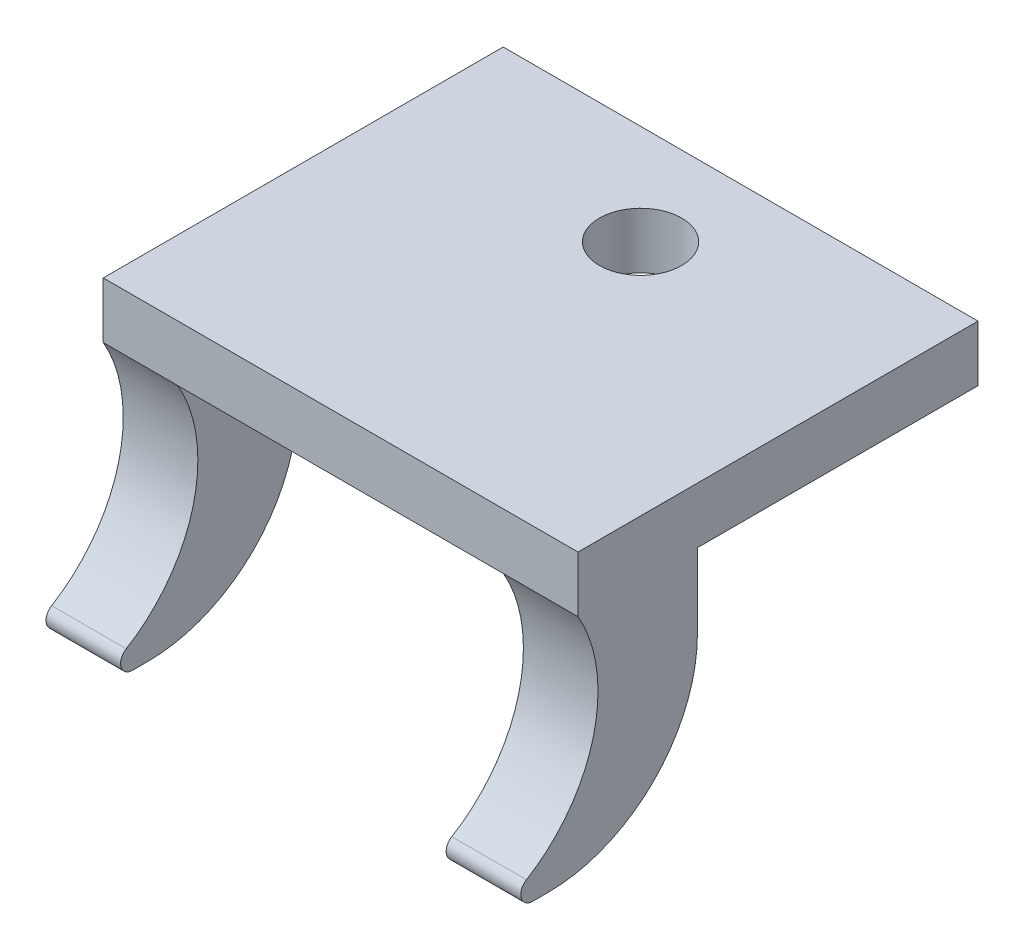
ISO-10303-21;
HEADER;
FILE_DESCRIPTION(('STEP AP214'),'2;1');
FILE_NAME('part.step','',(''),(''),'','','');
FILE_SCHEMA(('AUTOMOTIVE_DESIGN { 1 0 10303 214 1 1 1 1 }'));
ENDSEC;
DATA;
#1=APPLICATION_CONTEXT('core data for automotive mechanical design processes');
#2=APPLICATION_PROTOCOL_DEFINITION('international standard','automotive_design',2000,#1);
#3=PRODUCT_CONTEXT('',#1,'mechanical');
#4=PRODUCT('Part','Part','',(#3));
#5=PRODUCT_RELATED_PRODUCT_CATEGORY('part','',(#4));
#6=PRODUCT_DEFINITION_FORMATION('','',#4);
#7=PRODUCT_DEFINITION_CONTEXT('part definition',#1,'design');
#8=PRODUCT_DEFINITION('design','',#6,#7);
#9=PRODUCT_DEFINITION_SHAPE('','',#8);
#10=(LENGTH_UNIT() NAMED_UNIT(*) SI_UNIT(.MILLI.,.METRE.));
#11=(NAMED_UNIT(*) PLANE_ANGLE_UNIT() SI_UNIT($,.RADIAN.));
#12=(NAMED_UNIT(*) SI_UNIT($,.STERADIAN.) SOLID_ANGLE_UNIT());
#13=UNCERTAINTY_MEASURE_WITH_UNIT(LENGTH_MEASURE(1.E-05),#10,'distance_accuracy_value','');
#14=(GEOMETRIC_REPRESENTATION_CONTEXT(3) GLOBAL_UNCERTAINTY_ASSIGNED_CONTEXT((#13)) GLOBAL_UNIT_ASSIGNED_CONTEXT((#10,
#11,#12)) REPRESENTATION_CONTEXT('',''));
#15=CARTESIAN_POINT('',(0.,0.,0.));
#16=DIRECTION('',(0.,0.,1.));
#17=DIRECTION('',(1.,0.,0.));
#18=AXIS2_PLACEMENT_3D('',#15,#16,#17);
#19=CARTESIAN_POINT('',(0.,0.,0.));
#20=DIRECTION('',(0.,-1.,0.));
#21=DIRECTION('',(0.,0.,-1.));
#22=AXIS2_PLACEMENT_3D('',#19,#20,#21);
#23=PLANE('',#22);
#24=CARTESIAN_POINT('',(20.20062,0.,-25.5224165246659));
#25=DIRECTION('',(0.,1.,0.));
#26=DIRECTION('',(0.,0.,1.));
#27=AXIS2_PLACEMENT_3D('',#24,#25,#26);
#28=CIRCLE('',#27,3.5);
#29=CARTESIAN_POINT('',(20.20062,0.,-22.0224165246659));
#30=VERTEX_POINT('',#29);
#31=EDGE_CURVE('E228',#30,#30,#28,.T.);
#32=ORIENTED_EDGE('',*,*,#31,.T.);
#33=EDGE_LOOP('',(#32));
#34=FACE_BOUND('',#33,.T.);
#35=DIRECTION('',(0.,0.,1.));
#36=VECTOR('',#35,1.);
#37=CARTESIAN_POINT('',(6.35,0.,-10.16));
#38=LINE('',#37,#36);
#39=CARTESIAN_POINT('',(6.35,0.,-10.16));
#40=VERTEX_POINT('',#39);
#41=CARTESIAN_POINT('',(6.35,0.,0.));
#42=VERTEX_POINT('',#41);
#43=EDGE_CURVE('E151',#40,#42,#38,.T.);
#44=ORIENTED_EDGE('',*,*,#43,.F.);
#45=DIRECTION('',(-1.,0.,0.));
#46=VECTOR('',#45,1.);
#47=CARTESIAN_POINT('',(6.35,0.,-10.16));
#48=LINE('',#47,#46);
#49=CARTESIAN_POINT('',(0.,0.,-10.16));
#50=VERTEX_POINT('',#49);
#51=EDGE_CURVE('E162',#40,#50,#48,.T.);
#52=ORIENTED_EDGE('',*,*,#51,.T.);
#53=DIRECTION('',(0.,0.,1.));
#54=VECTOR('',#53,1.);
#55=CARTESIAN_POINT('',(0.,0.,0.));
#56=LINE('',#55,#54);
#57=CARTESIAN_POINT('',(0.,0.,-34.036));
#58=VERTEX_POINT('',#57);
#59=EDGE_CURVE('E232',#58,#50,#56,.T.);
#60=ORIENTED_EDGE('',*,*,#59,.F.);
#61=DIRECTION('',(-1.,0.,0.));
#62=VECTOR('',#61,1.);
#63=CARTESIAN_POINT('',(0.,0.,-34.036));
#64=LINE('',#63,#62);
#65=CARTESIAN_POINT('',(40.40124,0.,-34.036));
#66=VERTEX_POINT('',#65);
#67=EDGE_CURVE('E238',#66,#58,#64,.T.);
#68=ORIENTED_EDGE('',*,*,#67,.F.);
#69=DIRECTION('',(0.,0.,-1.));
#70=VECTOR('',#69,1.);
#71=CARTESIAN_POINT('',(40.40124,0.,0.));
#72=LINE('',#71,#70);
#73=CARTESIAN_POINT('',(40.40124,0.,-10.16));
#74=VERTEX_POINT('',#73);
#75=EDGE_CURVE('E253',#74,#66,#72,.T.);
#76=ORIENTED_EDGE('',*,*,#75,.F.);
#77=DIRECTION('',(1.,0.,0.));
#78=VECTOR('',#77,1.);
#79=CARTESIAN_POINT('',(34.05124,0.,-10.16));
#80=LINE('',#79,#78);
#81=CARTESIAN_POINT('',(34.05124,0.,-10.16));
#82=VERTEX_POINT('',#81);
#83=EDGE_CURVE('E208',#82,#74,#80,.T.);
#84=ORIENTED_EDGE('',*,*,#83,.F.);
#85=DIRECTION('',(0.,0.,1.));
#86=VECTOR('',#85,1.);
#87=CARTESIAN_POINT('',(34.05124,0.,-10.16));
#88=LINE('',#87,#86);
#89=CARTESIAN_POINT('',(34.05124,0.,0.));
#90=VERTEX_POINT('',#89);
#91=EDGE_CURVE('E205',#82,#90,#88,.T.);
#92=ORIENTED_EDGE('',*,*,#91,.T.);
#93=DIRECTION('',(1.,0.,0.));
#94=VECTOR('',#93,1.);
#95=CARTESIAN_POINT('',(0.,0.,0.));
#96=LINE('',#95,#94);
#97=EDGE_CURVE('E173',#42,#90,#96,.T.);
#98=ORIENTED_EDGE('',*,*,#97,.F.);
#99=EDGE_LOOP('',(#44,#52,#60,#68,#76,#84,#92,#98));
#100=FACE_BOUND('',#99,.T.);
#101=ADVANCED_FACE('F39',(#34,#100),#23,.T.);
#102=CARTESIAN_POINT('',(0.,4.7625,0.));
#103=DIRECTION('',(0.,-1.,0.));
#104=DIRECTION('',(0.,0.,-1.));
#105=AXIS2_PLACEMENT_3D('',#102,#103,#104);
#106=PLANE('',#105);
#107=CARTESIAN_POINT('',(20.20062,4.7625,-25.5224165246659));
#108=DIRECTION('',(0.,1.,0.));
#109=DIRECTION('',(0.,0.,1.));
#110=AXIS2_PLACEMENT_3D('',#107,#108,#109);
#111=CIRCLE('',#110,3.5);
#112=CARTESIAN_POINT('',(20.20062,4.7625,-22.0224165246659));
#113=VERTEX_POINT('',#112);
#114=EDGE_CURVE('E221',#113,#113,#111,.T.);
#115=ORIENTED_EDGE('',*,*,#114,.F.);
#116=EDGE_LOOP('',(#115));
#117=FACE_BOUND('',#116,.T.);
#118=DIRECTION('',(0.,0.,1.));
#119=VECTOR('',#118,1.);
#120=CARTESIAN_POINT('',(0.,4.7625,0.));
#121=LINE('',#120,#119);
#122=CARTESIAN_POINT('',(0.,4.7625,-34.036));
#123=VERTEX_POINT('',#122);
#124=CARTESIAN_POINT('',(0.,4.7625,0.));
#125=VERTEX_POINT('',#124);
#126=EDGE_CURVE('E233',#123,#125,#121,.T.);
#127=ORIENTED_EDGE('',*,*,#126,.T.);
#128=DIRECTION('',(1.,0.,0.));
#129=VECTOR('',#128,1.);
#130=CARTESIAN_POINT('',(0.,4.7625,0.));
#131=LINE('',#130,#129);
#132=CARTESIAN_POINT('',(40.40124,4.7625,0.));
#133=VERTEX_POINT('',#132);
#134=EDGE_CURVE('E237',#125,#133,#131,.T.);
#135=ORIENTED_EDGE('',*,*,#134,.T.);
#136=DIRECTION('',(0.,0.,-1.));
#137=VECTOR('',#136,1.);
#138=CARTESIAN_POINT('',(40.40124,4.7625,0.));
#139=LINE('',#138,#137);
#140=CARTESIAN_POINT('',(40.40124,4.7625,-34.036));
#141=VERTEX_POINT('',#140);
#142=EDGE_CURVE('E241',#133,#141,#139,.T.);
#143=ORIENTED_EDGE('',*,*,#142,.T.);
#144=DIRECTION('',(-1.,0.,0.));
#145=VECTOR('',#144,1.);
#146=CARTESIAN_POINT('',(0.,4.7625,-34.036));
#147=LINE('',#146,#145);
#148=EDGE_CURVE('E244',#141,#123,#147,.T.);
#149=ORIENTED_EDGE('',*,*,#148,.T.);
#150=EDGE_LOOP('',(#127,#135,#143,#149));
#151=FACE_BOUND('',#150,.T.);
#152=ADVANCED_FACE('F356',(#117,#151),#106,.F.);
#153=CARTESIAN_POINT('',(0.,4.7625,0.));
#154=DIRECTION('',(1.,0.,0.));
#155=DIRECTION('',(0.,0.,-1.));
#156=AXIS2_PLACEMENT_3D('',#153,#154,#155);
#157=PLANE('',#156);
#158=DIRECTION('',(0.,1.,0.));
#159=VECTOR('',#158,1.);
#160=CARTESIAN_POINT('',(0.,-19.05,-10.16));
#161=LINE('',#160,#159);
#162=CARTESIAN_POINT('',(0.,-6.35,-10.16));
#163=VERTEX_POINT('',#162);
#164=EDGE_CURVE('E165',#163,#50,#161,.T.);
#165=ORIENTED_EDGE('',*,*,#164,.F.);
#166=CARTESIAN_POINT('',(0.,-6.35,2.54000000000005));
#167=DIRECTION('',(1.,0.,0.));
#168=DIRECTION('',(0.,0.,-1.));
#169=AXIS2_PLACEMENT_3D('',#166,#167,#168);
#170=CIRCLE('',#169,12.7);
#171=CARTESIAN_POINT('',(0.,-19.05,2.54000000000005));
#172=VERTEX_POINT('',#171);
#173=EDGE_CURVE('E302',#163,#172,#170,.F.);
#174=ORIENTED_EDGE('',*,*,#173,.T.);
#175=DIRECTION('',(0.,0.,-1.));
#176=VECTOR('',#175,1.);
#177=CARTESIAN_POINT('',(0.,-19.05,10.9985226280624));
#178=LINE('',#177,#176);
#179=CARTESIAN_POINT('',(0.,-19.05,3.87111075558023));
#180=VERTEX_POINT('',#179);
#181=EDGE_CURVE('E179',#180,#172,#178,.T.);
#182=ORIENTED_EDGE('',*,*,#181,.F.);
#183=CARTESIAN_POINT('',(0.,-18.05,3.87111075558023));
#184=DIRECTION('',(1.,0.,0.));
#185=DIRECTION('',(0.,0.,-1.));
#186=AXIS2_PLACEMENT_3D('',#183,#184,#185);
#187=CIRCLE('',#186,1.);
#188=CARTESIAN_POINT('',(0.,-17.1959854014599,4.39135979736725));
#189=VERTEX_POINT('',#188);
#190=EDGE_CURVE('E277',#180,#189,#187,.F.);
#191=ORIENTED_EDGE('',*,*,#190,.T.);
#192=CARTESIAN_POINT('',(0.,-6.35,10.9985226280624));
#193=DIRECTION('',(-1.,0.,0.));
#194=DIRECTION('',(0.,0.,-1.));
#195=AXIS2_PLACEMENT_3D('',#192,#193,#194);
#196=CIRCLE('',#195,12.7);
#197=CARTESIAN_POINT('',(0.,0.,0.));
#198=VERTEX_POINT('',#197);
#199=EDGE_CURVE('E184',#198,#189,#196,.T.);
#200=ORIENTED_EDGE('',*,*,#199,.F.);
#201=DIRECTION('',(0.,-1.,0.));
#202=VECTOR('',#201,1.);
#203=CARTESIAN_POINT('',(0.,4.7625,0.));
#204=LINE('',#203,#202);
#205=EDGE_CURVE('E269',#125,#198,#204,.T.);
#206=ORIENTED_EDGE('',*,*,#205,.F.);
#207=ORIENTED_EDGE('',*,*,#126,.F.);
#208=DIRECTION('',(0.,-1.,0.));
#209=VECTOR('',#208,1.);
#210=CARTESIAN_POINT('',(0.,4.7625,-34.036));
#211=LINE('',#210,#209);
#212=EDGE_CURVE('E247',#123,#58,#211,.T.);
#213=ORIENTED_EDGE('',*,*,#212,.T.);
#214=ORIENTED_EDGE('',*,*,#59,.T.);
#215=EDGE_LOOP('',(#165,#174,#182,#191,#200,#206,#207,#213,#214));
#216=FACE_BOUND('',#215,.T.);
#217=ADVANCED_FACE('F362',(#216),#157,.F.);
#218=CARTESIAN_POINT('',(0.,4.7625,0.));
#219=DIRECTION('',(0.,0.,-1.));
#220=DIRECTION('',(-1.,0.,0.));
#221=AXIS2_PLACEMENT_3D('',#218,#219,#220);
#222=PLANE('',#221);
#223=EDGE_CURVE('E250',#198,#42,#96,.T.);
#224=ORIENTED_EDGE('',*,*,#223,.T.);
#225=ORIENTED_EDGE('',*,*,#97,.T.);
#226=DIRECTION('',(1.,0.,0.));
#227=VECTOR('',#226,1.);
#228=CARTESIAN_POINT('',(34.05124,0.,0.));
#229=LINE('',#228,#227);
#230=CARTESIAN_POINT('',(40.40124,0.,0.));
#231=VERTEX_POINT('',#230);
#232=EDGE_CURVE('E217',#90,#231,#229,.T.);
#233=ORIENTED_EDGE('',*,*,#232,.T.);
#234=DIRECTION('',(0.,-1.,0.));
#235=VECTOR('',#234,1.);
#236=CARTESIAN_POINT('',(40.40124,4.7625,0.));
#237=LINE('',#236,#235);
#238=EDGE_CURVE('E265',#133,#231,#237,.T.);
#239=ORIENTED_EDGE('',*,*,#238,.F.);
#240=ORIENTED_EDGE('',*,*,#134,.F.);
#241=ORIENTED_EDGE('',*,*,#205,.T.);
#242=EDGE_LOOP('',(#224,#225,#233,#239,#240,#241));
#243=FACE_BOUND('',#242,.T.);
#244=ADVANCED_FACE('F319',(#243),#222,.F.);
#245=CARTESIAN_POINT('',(40.40124,4.7625,0.));
#246=DIRECTION('',(-1.,0.,0.));
#247=DIRECTION('',(0.,0.,1.));
#248=AXIS2_PLACEMENT_3D('',#245,#246,#247);
#249=PLANE('',#248);
#250=DIRECTION('',(0.,0.,-1.));
#251=VECTOR('',#250,1.);
#252=CARTESIAN_POINT('',(40.40124,-19.05,10.9985226280624));
#253=LINE('',#252,#251);
#254=CARTESIAN_POINT('',(40.40124,-19.05,3.87111075558023));
#255=VERTEX_POINT('',#254);
#256=CARTESIAN_POINT('',(40.40124,-19.05,2.54000000000005));
#257=VERTEX_POINT('',#256);
#258=EDGE_CURVE('E212',#255,#257,#253,.T.);
#259=ORIENTED_EDGE('',*,*,#258,.T.);
#260=CARTESIAN_POINT('',(40.40124,-6.35,2.54000000000005));
#261=DIRECTION('',(-1.,0.,0.));
#262=DIRECTION('',(0.,0.,1.));
#263=AXIS2_PLACEMENT_3D('',#260,#261,#262);
#264=CIRCLE('',#263,12.7);
#265=CARTESIAN_POINT('',(40.40124,-6.35,-10.16));
#266=VERTEX_POINT('',#265);
#267=EDGE_CURVE('E62',#257,#266,#264,.F.);
#268=ORIENTED_EDGE('',*,*,#267,.T.);
#269=DIRECTION('',(0.,1.,0.));
#270=VECTOR('',#269,1.);
#271=CARTESIAN_POINT('',(40.40124,-19.05,-10.16));
#272=LINE('',#271,#270);
#273=EDGE_CURVE('E198',#266,#74,#272,.T.);
#274=ORIENTED_EDGE('',*,*,#273,.T.);
#275=ORIENTED_EDGE('',*,*,#75,.T.);
#276=DIRECTION('',(0.,-1.,0.));
#277=VECTOR('',#276,1.);
#278=CARTESIAN_POINT('',(40.40124,4.7625,-34.036));
#279=LINE('',#278,#277);
#280=EDGE_CURVE('E261',#141,#66,#279,.T.);
#281=ORIENTED_EDGE('',*,*,#280,.F.);
#282=ORIENTED_EDGE('',*,*,#142,.F.);
#283=ORIENTED_EDGE('',*,*,#238,.T.);
#284=CARTESIAN_POINT('',(40.40124,-6.35,10.9985226280624));
#285=DIRECTION('',(-1.,0.,0.));
#286=DIRECTION('',(0.,0.,-1.));
#287=AXIS2_PLACEMENT_3D('',#284,#285,#286);
#288=CIRCLE('',#287,12.7);
#289=CARTESIAN_POINT('',(40.40124,-17.1959854014599,4.39135979736725));
#290=VERTEX_POINT('',#289);
#291=EDGE_CURVE('E170',#231,#290,#288,.T.);
#292=ORIENTED_EDGE('',*,*,#291,.T.);
#293=CARTESIAN_POINT('',(40.40124,-18.05,3.87111075558023));
#294=DIRECTION('',(-1.,0.,0.));
#295=DIRECTION('',(0.,0.,1.));
#296=AXIS2_PLACEMENT_3D('',#293,#294,#295);
#297=CIRCLE('',#296,1.);
#298=EDGE_CURVE('E290',#290,#255,#297,.F.);
#299=ORIENTED_EDGE('',*,*,#298,.T.);
#300=EDGE_LOOP('',(#259,#268,#274,#275,#281,#282,#283,#292,#299));
#301=FACE_BOUND('',#300,.T.);
#302=ADVANCED_FACE('F341',(#301),#249,.F.);
#303=CARTESIAN_POINT('',(0.,4.7625,-34.036));
#304=DIRECTION('',(0.,0.,1.));
#305=DIRECTION('',(1.,0.,0.));
#306=AXIS2_PLACEMENT_3D('',#303,#304,#305);
#307=PLANE('',#306);
#308=ORIENTED_EDGE('',*,*,#67,.T.);
#309=ORIENTED_EDGE('',*,*,#212,.F.);
#310=ORIENTED_EDGE('',*,*,#148,.F.);
#311=ORIENTED_EDGE('',*,*,#280,.T.);
#312=EDGE_LOOP('',(#308,#309,#310,#311));
#313=FACE_BOUND('',#312,.T.);
#314=ADVANCED_FACE('F367',(#313),#307,.F.);
#315=CARTESIAN_POINT('',(20.20062,4.7625,-25.5224165246659));
#316=DIRECTION('',(0.,1.,0.));
#317=DIRECTION('',(0.,0.,1.));
#318=AXIS2_PLACEMENT_3D('',#315,#316,#317);
#319=CYLINDRICAL_SURFACE('',#318,3.5);
#320=ORIENTED_EDGE('',*,*,#31,.F.);
#321=EDGE_LOOP('',(#320));
#322=FACE_BOUND('',#321,.T.);
#323=ORIENTED_EDGE('',*,*,#114,.T.);
#324=EDGE_LOOP('',(#323));
#325=FACE_BOUND('',#324,.T.);
#326=ADVANCED_FACE('F370',(#322,#325),#319,.F.);
#327=CARTESIAN_POINT('',(34.05124,-6.35,10.9985226280624));
#328=DIRECTION('',(1.,0.,0.));
#329=DIRECTION('',(0.,0.,-1.));
#330=AXIS2_PLACEMENT_3D('',#327,#328,#329);
#331=CYLINDRICAL_SURFACE('',#330,12.7);
#332=CARTESIAN_POINT('',(34.05124,-6.35,10.9985226280624));
#333=DIRECTION('',(-1.,0.,0.));
#334=DIRECTION('',(0.,0.,-1.));
#335=AXIS2_PLACEMENT_3D('',#332,#333,#334);
#336=CIRCLE('',#335,12.7);
#337=CARTESIAN_POINT('',(34.05124,-17.1959854014599,4.39135979736725));
#338=VERTEX_POINT('',#337);
#339=EDGE_CURVE('E193',#90,#338,#336,.T.);
#340=ORIENTED_EDGE('',*,*,#339,.T.);
#341=DIRECTION('',(1.,0.,0.));
#342=VECTOR('',#341,1.);
#343=CARTESIAN_POINT('',(34.05124,-17.1959854014599,4.39135979736725));
#344=LINE('',#343,#342);
#345=EDGE_CURVE('E286',#338,#290,#344,.T.);
#346=ORIENTED_EDGE('',*,*,#345,.T.);
#347=ORIENTED_EDGE('',*,*,#291,.F.);
#348=ORIENTED_EDGE('',*,*,#232,.F.);
#349=EDGE_LOOP('',(#340,#346,#347,#348));
#350=FACE_BOUND('',#349,.T.);
#351=ADVANCED_FACE('F330',(#350),#331,.F.);
#352=CARTESIAN_POINT('',(34.05124,-19.05,-10.16));
#353=DIRECTION('',(0.,0.,-1.));
#354=DIRECTION('',(0.,1.,0.));
#355=AXIS2_PLACEMENT_3D('',#352,#353,#354);
#356=PLANE('',#355);
#357=ORIENTED_EDGE('',*,*,#273,.F.);
#358=DIRECTION('',(1.,0.,0.));
#359=VECTOR('',#358,1.);
#360=CARTESIAN_POINT('',(34.05124,-6.35,-10.16));
#361=LINE('',#360,#359);
#362=CARTESIAN_POINT('',(34.05124,-6.35,-10.16));
#363=VERTEX_POINT('',#362);
#364=EDGE_CURVE('E48',#266,#363,#361,.F.);
#365=ORIENTED_EDGE('',*,*,#364,.T.);
#366=DIRECTION('',(0.,1.,0.));
#367=VECTOR('',#366,1.);
#368=CARTESIAN_POINT('',(34.05124,-19.05,-10.16));
#369=LINE('',#368,#367);
#370=EDGE_CURVE('E202',#363,#82,#369,.T.);
#371=ORIENTED_EDGE('',*,*,#370,.T.);
#372=ORIENTED_EDGE('',*,*,#83,.T.);
#373=EDGE_LOOP('',(#357,#365,#371,#372));
#374=FACE_BOUND('',#373,.T.);
#375=ADVANCED_FACE('F333',(#374),#356,.T.);
#376=CARTESIAN_POINT('',(34.05124,-19.05,10.9985226280624));
#377=DIRECTION('',(0.,-1.,0.));
#378=DIRECTION('',(0.,0.,-1.));
#379=AXIS2_PLACEMENT_3D('',#376,#377,#378);
#380=PLANE('',#379);
#381=DIRECTION('',(0.,0.,-1.));
#382=VECTOR('',#381,1.);
#383=CARTESIAN_POINT('',(34.05124,-19.05,10.9985226280624));
#384=LINE('',#383,#382);
#385=CARTESIAN_POINT('',(34.05124,-19.05,3.87111075558023));
#386=VERTEX_POINT('',#385);
#387=CARTESIAN_POINT('',(34.05124,-19.05,2.54000000000005));
#388=VERTEX_POINT('',#387);
#389=EDGE_CURVE('E197',#386,#388,#384,.T.);
#390=ORIENTED_EDGE('',*,*,#389,.T.);
#391=DIRECTION('',(1.,0.,0.));
#392=VECTOR('',#391,1.);
#393=CARTESIAN_POINT('',(34.05124,-19.05,2.54000000000005));
#394=LINE('',#393,#392);
#395=EDGE_CURVE('E310',#388,#257,#394,.T.);
#396=ORIENTED_EDGE('',*,*,#395,.T.);
#397=ORIENTED_EDGE('',*,*,#258,.F.);
#398=DIRECTION('',(1.,0.,0.));
#399=VECTOR('',#398,1.);
#400=CARTESIAN_POINT('',(34.05124,-19.05,3.87111075558023));
#401=LINE('',#400,#399);
#402=EDGE_CURVE('E293',#255,#386,#401,.F.);
#403=ORIENTED_EDGE('',*,*,#402,.T.);
#404=EDGE_LOOP('',(#390,#396,#397,#403));
#405=FACE_BOUND('',#404,.T.);
#406=ADVANCED_FACE('F339',(#405),#380,.T.);
#407=CARTESIAN_POINT('',(34.05124,-6.35,10.9985226280624));
#408=DIRECTION('',(1.,0.,0.));
#409=DIRECTION('',(0.,0.,-1.));
#410=AXIS2_PLACEMENT_3D('',#407,#408,#409);
#411=PLANE('',#410);
#412=ORIENTED_EDGE('',*,*,#370,.F.);
#413=CARTESIAN_POINT('',(34.05124,-6.35,2.54000000000005));
#414=DIRECTION('',(1.,0.,0.));
#415=DIRECTION('',(0.,0.,-1.));
#416=AXIS2_PLACEMENT_3D('',#413,#414,#415);
#417=CIRCLE('',#416,12.7);
#418=EDGE_CURVE('E11',#363,#388,#417,.F.);
#419=ORIENTED_EDGE('',*,*,#418,.T.);
#420=ORIENTED_EDGE('',*,*,#389,.F.);
#421=CARTESIAN_POINT('',(34.05124,-18.05,3.87111075558023));
#422=DIRECTION('',(1.,0.,0.));
#423=DIRECTION('',(0.,0.,-1.));
#424=AXIS2_PLACEMENT_3D('',#421,#422,#423);
#425=CIRCLE('',#424,1.);
#426=EDGE_CURVE('E296',#386,#338,#425,.F.);
#427=ORIENTED_EDGE('',*,*,#426,.T.);
#428=ORIENTED_EDGE('',*,*,#339,.F.);
#429=ORIENTED_EDGE('',*,*,#91,.F.);
#430=EDGE_LOOP('',(#412,#419,#420,#427,#428,#429));
#431=FACE_BOUND('',#430,.T.);
#432=ADVANCED_FACE('F324',(#431),#411,.F.);
#433=CARTESIAN_POINT('',(6.35,-6.35,10.9985226280624));
#434=DIRECTION('',(-1.,0.,0.));
#435=DIRECTION('',(0.,0.,1.));
#436=AXIS2_PLACEMENT_3D('',#433,#434,#435);
#437=CYLINDRICAL_SURFACE('',#436,12.7);
#438=ORIENTED_EDGE('',*,*,#199,.T.);
#439=DIRECTION('',(-1.,0.,0.));
#440=VECTOR('',#439,1.);
#441=CARTESIAN_POINT('',(6.35,-17.1959854014599,4.39135979736725));
#442=LINE('',#441,#440);
#443=CARTESIAN_POINT('',(6.35,-17.1959854014599,4.39135979736725));
#444=VERTEX_POINT('',#443);
#445=EDGE_CURVE('E280',#189,#444,#442,.F.);
#446=ORIENTED_EDGE('',*,*,#445,.T.);
#447=CARTESIAN_POINT('',(6.35,-6.35,10.9985226280624));
#448=DIRECTION('',(-1.,0.,0.));
#449=DIRECTION('',(0.,0.,-1.));
#450=AXIS2_PLACEMENT_3D('',#447,#448,#449);
#451=CIRCLE('',#450,12.7);
#452=EDGE_CURVE('E176',#42,#444,#451,.T.);
#453=ORIENTED_EDGE('',*,*,#452,.F.);
#454=ORIENTED_EDGE('',*,*,#223,.F.);
#455=EDGE_LOOP('',(#438,#446,#453,#454));
#456=FACE_BOUND('',#455,.T.);
#457=ADVANCED_FACE('F391',(#456),#437,.F.);
#458=CARTESIAN_POINT('',(6.35,-19.05,10.9985226280624));
#459=DIRECTION('',(0.,1.,0.));
#460=DIRECTION('',(0.,0.,1.));
#461=AXIS2_PLACEMENT_3D('',#458,#459,#460);
#462=PLANE('',#461);
#463=ORIENTED_EDGE('',*,*,#181,.T.);
#464=DIRECTION('',(-1.,0.,0.));
#465=VECTOR('',#464,1.);
#466=CARTESIAN_POINT('',(6.35,-19.05,2.54000000000005));
#467=LINE('',#466,#465);
#468=CARTESIAN_POINT('',(6.35,-19.05,2.54000000000005));
#469=VERTEX_POINT('',#468);
#470=EDGE_CURVE('E305',#172,#469,#467,.F.);
#471=ORIENTED_EDGE('',*,*,#470,.T.);
#472=DIRECTION('',(0.,0.,-1.));
#473=VECTOR('',#472,1.);
#474=CARTESIAN_POINT('',(6.35,-19.05,10.9985226280624));
#475=LINE('',#474,#473);
#476=CARTESIAN_POINT('',(6.35,-19.05,3.87111075558023));
#477=VERTEX_POINT('',#476);
#478=EDGE_CURVE('E159',#477,#469,#475,.T.);
#479=ORIENTED_EDGE('',*,*,#478,.F.);
#480=DIRECTION('',(-1.,0.,0.));
#481=VECTOR('',#480,1.);
#482=CARTESIAN_POINT('',(6.35,-19.05,3.87111075558023));
#483=LINE('',#482,#481);
#484=EDGE_CURVE('E273',#477,#180,#483,.T.);
#485=ORIENTED_EDGE('',*,*,#484,.T.);
#486=EDGE_LOOP('',(#463,#471,#479,#485));
#487=FACE_BOUND('',#486,.T.);
#488=ADVANCED_FACE('F396',(#487),#462,.F.);
#489=CARTESIAN_POINT('',(6.35,-19.05,-10.16));
#490=DIRECTION('',(0.,0.,1.));
#491=DIRECTION('',(0.,-1.,0.));
#492=AXIS2_PLACEMENT_3D('',#489,#490,#491);
#493=PLANE('',#492);
#494=DIRECTION('',(0.,1.,0.));
#495=VECTOR('',#494,1.);
#496=CARTESIAN_POINT('',(6.35,-19.05,-10.16));
#497=LINE('',#496,#495);
#498=CARTESIAN_POINT('',(6.35,-6.35,-10.16));
#499=VERTEX_POINT('',#498);
#500=EDGE_CURVE('E145',#499,#40,#497,.T.);
#501=ORIENTED_EDGE('',*,*,#500,.F.);
#502=DIRECTION('',(-1.,0.,0.));
#503=VECTOR('',#502,1.);
#504=CARTESIAN_POINT('',(6.35,-6.35,-10.16));
#505=LINE('',#504,#503);
#506=EDGE_CURVE('E299',#499,#163,#505,.T.);
#507=ORIENTED_EDGE('',*,*,#506,.T.);
#508=ORIENTED_EDGE('',*,*,#164,.T.);
#509=ORIENTED_EDGE('',*,*,#51,.F.);
#510=EDGE_LOOP('',(#501,#507,#508,#509));
#511=FACE_BOUND('',#510,.T.);
#512=ADVANCED_FACE('F163',(#511),#493,.F.);
#513=CARTESIAN_POINT('',(6.35,-6.35,10.9985226280624));
#514=DIRECTION('',(-1.,0.,0.));
#515=DIRECTION('',(0.,0.,-1.));
#516=AXIS2_PLACEMENT_3D('',#513,#514,#515);
#517=PLANE('',#516);
#518=ORIENTED_EDGE('',*,*,#478,.T.);
#519=CARTESIAN_POINT('',(6.35,-6.35,2.54000000000005));
#520=DIRECTION('',(-1.,0.,0.));
#521=DIRECTION('',(0.,0.,1.));
#522=AXIS2_PLACEMENT_3D('',#519,#520,#521);
#523=CIRCLE('',#522,12.7);
#524=EDGE_CURVE('E154',#469,#499,#523,.F.);
#525=ORIENTED_EDGE('',*,*,#524,.T.);
#526=ORIENTED_EDGE('',*,*,#500,.T.);
#527=ORIENTED_EDGE('',*,*,#43,.T.);
#528=ORIENTED_EDGE('',*,*,#452,.T.);
#529=CARTESIAN_POINT('',(6.35,-18.05,3.87111075558023));
#530=DIRECTION('',(-1.,0.,0.));
#531=DIRECTION('',(0.,0.,1.));
#532=AXIS2_PLACEMENT_3D('',#529,#530,#531);
#533=CIRCLE('',#532,1.);
#534=EDGE_CURVE('E283',#444,#477,#533,.F.);
#535=ORIENTED_EDGE('',*,*,#534,.T.);
#536=EDGE_LOOP('',(#518,#525,#526,#527,#528,#535));
#537=FACE_BOUND('',#536,.T.);
#538=ADVANCED_FACE('F148',(#537),#517,.F.);
#539=CARTESIAN_POINT('',(6.35,-18.05,3.87111075558023));
#540=DIRECTION('',(-1.,0.,0.));
#541=DIRECTION('',(0.,0.,1.));
#542=AXIS2_PLACEMENT_3D('',#539,#540,#541);
#543=CYLINDRICAL_SURFACE('',#542,1.);
#544=ORIENTED_EDGE('',*,*,#534,.F.);
#545=ORIENTED_EDGE('',*,*,#445,.F.);
#546=ORIENTED_EDGE('',*,*,#190,.F.);
#547=ORIENTED_EDGE('',*,*,#484,.F.);
#548=EDGE_LOOP('',(#544,#545,#546,#547));
#549=FACE_BOUND('',#548,.T.);
#550=ADVANCED_FACE('F346',(#549),#543,.T.);
#551=CARTESIAN_POINT('',(34.05124,-18.05,3.87111075558023));
#552=DIRECTION('',(1.,0.,0.));
#553=DIRECTION('',(0.,0.,-1.));
#554=AXIS2_PLACEMENT_3D('',#551,#552,#553);
#555=CYLINDRICAL_SURFACE('',#554,1.);
#556=ORIENTED_EDGE('',*,*,#426,.F.);
#557=ORIENTED_EDGE('',*,*,#402,.F.);
#558=ORIENTED_EDGE('',*,*,#298,.F.);
#559=ORIENTED_EDGE('',*,*,#345,.F.);
#560=EDGE_LOOP('',(#556,#557,#558,#559));
#561=FACE_BOUND('',#560,.T.);
#562=ADVANCED_FACE('F343',(#561),#555,.T.);
#563=CARTESIAN_POINT('',(6.35,-6.35,2.54000000000005));
#564=DIRECTION('',(-1.,0.,0.));
#565=DIRECTION('',(0.,0.,1.));
#566=AXIS2_PLACEMENT_3D('',#563,#564,#565);
#567=CYLINDRICAL_SURFACE('',#566,12.7);
#568=ORIENTED_EDGE('',*,*,#524,.F.);
#569=ORIENTED_EDGE('',*,*,#470,.F.);
#570=ORIENTED_EDGE('',*,*,#173,.F.);
#571=ORIENTED_EDGE('',*,*,#506,.F.);
#572=EDGE_LOOP('',(#568,#569,#570,#571));
#573=FACE_BOUND('',#572,.T.);
#574=ADVANCED_FACE('F345',(#573),#567,.T.);
#575=CARTESIAN_POINT('',(34.05124,-6.35,2.54000000000005));
#576=DIRECTION('',(1.,0.,0.));
#577=DIRECTION('',(0.,0.,-1.));
#578=AXIS2_PLACEMENT_3D('',#575,#576,#577);
#579=CYLINDRICAL_SURFACE('',#578,12.7);
#580=ORIENTED_EDGE('',*,*,#418,.F.);
#581=ORIENTED_EDGE('',*,*,#364,.F.);
#582=ORIENTED_EDGE('',*,*,#267,.F.);
#583=ORIENTED_EDGE('',*,*,#395,.F.);
#584=EDGE_LOOP('',(#580,#581,#582,#583));
#585=FACE_BOUND('',#584,.T.);
#586=ADVANCED_FACE('F41',(#585),#579,.T.);
#587=CLOSED_SHELL('',(#101,#152,#217,#244,#302,#314,#326,#351,#375,#406,#432,#457,#488,#512,
#538,#550,#562,#574,#586));
#588=MANIFOLD_SOLID_BREP('B2',#587);
#589=ADVANCED_BREP_SHAPE_REPRESENTATION('',(#18,#588),#14);
#590=SHAPE_DEFINITION_REPRESENTATION(#9,#589);
ENDSEC;
END-ISO-10303-21;
